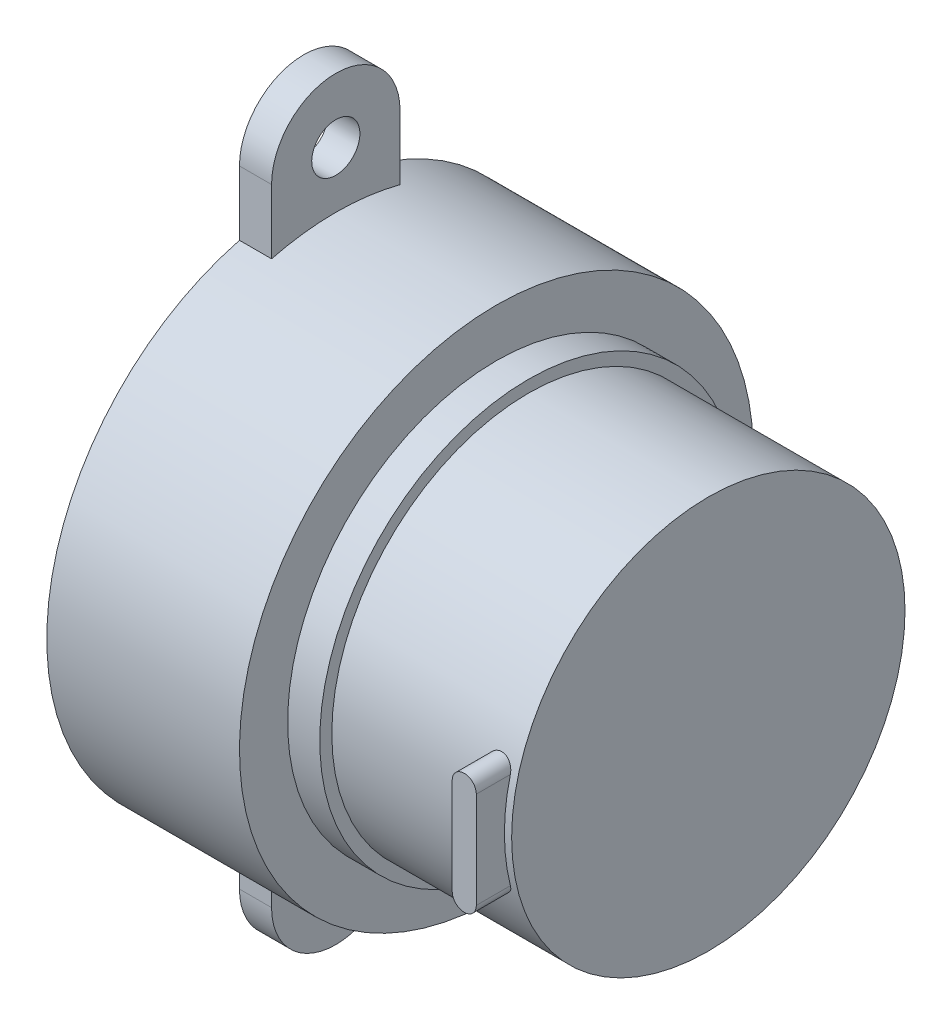
ISO-10303-21;
HEADER;
FILE_DESCRIPTION(('STEP AP214'),'2;1');
FILE_NAME('part.step','',(''),(''),'','','');
FILE_SCHEMA(('AUTOMOTIVE_DESIGN { 1 0 10303 214 1 1 1 1 }'));
ENDSEC;
DATA;
#1=APPLICATION_CONTEXT('core data for automotive mechanical design processes');
#2=APPLICATION_PROTOCOL_DEFINITION('international standard','automotive_design',2000,#1);
#3=PRODUCT_CONTEXT('',#1,'mechanical');
#4=PRODUCT('Part','Part','',(#3));
#5=PRODUCT_RELATED_PRODUCT_CATEGORY('part','',(#4));
#6=PRODUCT_DEFINITION_FORMATION('','',#4);
#7=PRODUCT_DEFINITION_CONTEXT('part definition',#1,'design');
#8=PRODUCT_DEFINITION('design','',#6,#7);
#9=PRODUCT_DEFINITION_SHAPE('','',#8);
#10=(LENGTH_UNIT() NAMED_UNIT(*) SI_UNIT(.MILLI.,.METRE.));
#11=(NAMED_UNIT(*) PLANE_ANGLE_UNIT() SI_UNIT($,.RADIAN.));
#12=(NAMED_UNIT(*) SI_UNIT($,.STERADIAN.) SOLID_ANGLE_UNIT());
#13=UNCERTAINTY_MEASURE_WITH_UNIT(LENGTH_MEASURE(1.E-05),#10,'distance_accuracy_value','');
#14=(GEOMETRIC_REPRESENTATION_CONTEXT(3) GLOBAL_UNCERTAINTY_ASSIGNED_CONTEXT((#13)) GLOBAL_UNIT_ASSIGNED_CONTEXT((#10,
#11,#12)) REPRESENTATION_CONTEXT('',''));
#15=CARTESIAN_POINT('',(0.,0.,0.));
#16=DIRECTION('',(0.,0.,1.));
#17=DIRECTION('',(1.,0.,0.));
#18=AXIS2_PLACEMENT_3D('',#15,#16,#17);
#19=CARTESIAN_POINT('',(25.2,0.,0.));
#20=DIRECTION('',(1.,0.,0.));
#21=DIRECTION('',(0.,1.,0.));
#22=AXIS2_PLACEMENT_3D('',#19,#20,#21);
#23=CYLINDRICAL_SURFACE('',#22,12.25);
#24=CARTESIAN_POINT('',(14.,0.,0.));
#25=DIRECTION('',(1.,0.,0.));
#26=DIRECTION('',(0.,1.,0.));
#27=AXIS2_PLACEMENT_3D('',#24,#25,#26);
#28=CIRCLE('',#27,12.25);
#29=CARTESIAN_POINT('',(14.,12.25,0.));
#30=VERTEX_POINT('',#29);
#31=EDGE_CURVE('E288',#30,#30,#28,.T.);
#32=ORIENTED_EDGE('',*,*,#31,.T.);
#33=EDGE_LOOP('',(#32));
#34=FACE_BOUND('',#33,.T.);
#35=CARTESIAN_POINT('',(25.2,0.,0.));
#36=DIRECTION('',(1.,0.,0.));
#37=DIRECTION('',(0.,1.,0.));
#38=AXIS2_PLACEMENT_3D('',#35,#36,#37);
#39=CIRCLE('',#38,12.25);
#40=CARTESIAN_POINT('',(25.2,12.25,0.));
#41=VERTEX_POINT('',#40);
#42=EDGE_CURVE('E279',#41,#41,#39,.T.);
#43=ORIENTED_EDGE('',*,*,#42,.F.);
#44=EDGE_LOOP('',(#43));
#45=FACE_BOUND('',#44,.T.);
#46=CARTESIAN_POINT('',(23.25,0.,0.));
#47=DIRECTION('',(1.,0.,0.));
#48=DIRECTION('',(0.,0.,-1.));
#49=AXIS2_PLACEMENT_3D('',#46,#47,#48);
#50=CIRCLE('',#49,12.25);
#51=CARTESIAN_POINT('',(23.25,-3.00414968149156,11.8759245825828));
#52=VERTEX_POINT('',#51);
#53=CARTESIAN_POINT('',(23.25,2.99585031850844,11.8780209155016));
#54=VERTEX_POINT('',#53);
#55=EDGE_CURVE('E53',#52,#54,#50,.F.);
#56=ORIENTED_EDGE('',*,*,#55,.T.);
#57=CARTESIAN_POINT('',(23.25,2.99585031850844,11.8780209155016));
#58=CARTESIAN_POINT('',(23.2500018151062,3.03936068676981,11.8670464450805));
#59=CARTESIAN_POINT('',(23.2537974298679,3.08284329070902,11.8558227008728));
#60=CARTESIAN_POINT('',(23.2688451062788,3.16850120592498,11.8332189007074));
#61=CARTESIAN_POINT('',(23.2801073854855,3.21067464280716,11.8218386515107));
#62=CARTESIAN_POINT('',(23.3097824751331,3.29248410159032,11.7993155613016));
#63=CARTESIAN_POINT('',(23.3281929388966,3.33212095125832,11.7881726436406));
#64=CARTESIAN_POINT('',(23.3716994229791,3.40772414334932,11.7665400079626));
#65=CARTESIAN_POINT('',(23.3967934655885,3.44369156722929,11.7560500978477));
#66=CARTESIAN_POINT('',(23.4528373335261,3.51063610469061,11.7362321809651));
#67=CARTESIAN_POINT('',(23.4837427801508,3.54164794185834,11.7268962036418));
#68=CARTESIAN_POINT('',(23.5507292867365,3.59798815097007,11.7097331714132));
#69=CARTESIAN_POINT('',(23.5868095552144,3.62331739054449,11.7019058861836));
#70=CARTESIAN_POINT('',(23.6617666674759,3.66659923504669,11.6884151056331));
#71=CARTESIAN_POINT('',(23.700498140881,3.68478243580946,11.6826844737521));
#72=CARTESIAN_POINT('',(23.7807120063835,3.7143474497353,11.6733185434752));
#73=CARTESIAN_POINT('',(23.822193541531,3.72573137066494,11.6696825957426));
#74=CARTESIAN_POINT('',(23.9047698133225,3.74091145805983,11.6648250050945));
#75=CARTESIAN_POINT('',(23.9458018023632,3.7450183510329,11.6635045203056));
#76=CARTESIAN_POINT('',(24.0279932259208,3.74645336840738,11.6630436916266));
#77=CARTESIAN_POINT('',(24.0691526391212,3.7437825712727,11.6639030008884));
#78=CARTESIAN_POINT('',(24.1494901567527,3.73189788396824,11.667710784042));
#79=CARTESIAN_POINT('',(24.1886918924031,3.72282787711424,11.6706133138722));
#80=CARTESIAN_POINT('',(24.2649764272577,3.69862275754783,11.6783067999213));
#81=CARTESIAN_POINT('',(24.3020591252911,3.68348735552691,11.683097846219));
#82=CARTESIAN_POINT('',(24.3736793109031,3.64738389093934,11.6944197036433));
#83=CARTESIAN_POINT('',(24.4081707554275,3.62633244906429,11.7009753240118));
#84=CARTESIAN_POINT('',(24.473150006227,3.57915305990342,11.7154927824416));
#85=CARTESIAN_POINT('',(24.5036370877851,3.55302419581202,11.723454874439));
#86=CARTESIAN_POINT('',(24.561053303903,3.49529222678644,11.740799574558));
#87=CARTESIAN_POINT('',(24.5877903283686,3.46351138808617,11.7502263959793));
#88=CARTESIAN_POINT('',(24.6355834649159,3.39615040145115,11.7698722460997));
#89=CARTESIAN_POINT('',(24.6566383691803,3.36056944798666,11.7800914426362));
#90=CARTESIAN_POINT('',(24.6933205391197,3.28505291906219,11.8013780947872));
#91=CARTESIAN_POINT('',(24.7086962186115,3.24499992062909,11.8124631333471));
#92=CARTESIAN_POINT('',(24.7324121251577,3.16288185681707,11.8347153690934));
#93=CARTESIAN_POINT('',(24.7407514479441,3.12081653356071,11.8458825766537));
#94=CARTESIAN_POINT('',(24.7502415166429,3.03501998587593,11.8681570908992));
#95=CARTESIAN_POINT('',(24.7512563678795,2.99127233837725,11.8792594641677));
#96=CARTESIAN_POINT('',(24.745648493211,2.9041171525149,11.9008663292481));
#97=CARTESIAN_POINT('',(24.7390259190927,2.86070960740928,11.9113708329378));
#98=CARTESIAN_POINT('',(24.7183295244998,2.77586395777271,11.9314276301441));
#99=CARTESIAN_POINT('',(24.7043159285996,2.73441284364693,11.94098688884));
#100=CARTESIAN_POINT('',(24.66918580401,2.65438399449385,11.9590312834866));
#101=CARTESIAN_POINT('',(24.6480701534638,2.61580590494741,11.9675165520539));
#102=CARTESIAN_POINT('',(24.5998539783655,2.54361688917972,11.9830650080282));
#103=CARTESIAN_POINT('',(24.5729052346726,2.50991077687006,11.9901568513219));
#104=CARTESIAN_POINT('',(24.5134797521601,2.44749412846226,12.0030533675291));
#105=CARTESIAN_POINT('',(24.4810037610676,2.41878291771393,12.0088582143036));
#106=CARTESIAN_POINT('',(24.4122930727206,2.36791903491718,12.0189898935667));
#107=CARTESIAN_POINT('',(24.3761675224157,2.34562526986073,12.0233489070713));
#108=CARTESIAN_POINT('',(24.3005664902398,2.3074077175077,12.0307418889033));
#109=CARTESIAN_POINT('',(24.2610913397067,2.29148330105205,12.0337759881074));
#110=CARTESIAN_POINT('',(24.1806147268659,2.26672641202528,12.0384637128144));
#111=CARTESIAN_POINT('',(24.1396491161946,2.25778144268983,12.0401392540498));
#112=CARTESIAN_POINT('',(24.0567690501018,2.246834830891,12.0421868842401));
#113=CARTESIAN_POINT('',(24.0148546440712,2.24483282783406,12.0425590408883));
#114=CARTESIAN_POINT('',(23.9316030990672,2.24782367253474,12.0420011082001));
#115=CARTESIAN_POINT('',(23.890263990536,2.25276387584892,12.0410808198217));
#116=CARTESIAN_POINT('',(23.8090165682158,2.26938995427252,12.0379582959601));
#117=CARTESIAN_POINT('',(23.7691082370515,2.28107574743349,12.0357560760504));
#118=CARTESIAN_POINT('',(23.6918233607202,2.31083731345606,12.0300772658401));
#119=CARTESIAN_POINT('',(23.6544482093571,2.32891657065208,12.0265999806114));
#120=CARTESIAN_POINT('',(23.5832864541981,2.37090498655441,12.0183927898931));
#121=CARTESIAN_POINT('',(23.5494997901268,2.39481404731599,12.0136629054479));
#122=CARTESIAN_POINT('',(23.486151169037,2.44796054830398,12.0029466436428));
#123=CARTESIAN_POINT('',(23.4566272370326,2.47724121762638,11.9969500077987));
#124=CARTESIAN_POINT('',(23.4029056613511,2.54012129001714,11.98379379772));
#125=CARTESIAN_POINT('',(23.3787096720832,2.57372202941914,11.9766338634591));
#126=CARTESIAN_POINT('',(23.3358691767155,2.64487253032391,11.9611244105882));
#127=CARTESIAN_POINT('',(23.3173294663477,2.68248121116879,11.9527562325449));
#128=CARTESIAN_POINT('',(23.2868217247977,2.76003265687349,11.9350867593904));
#129=CARTESIAN_POINT('',(23.2748469811797,2.7999729912818,11.925786428926));
#130=CARTESIAN_POINT('',(23.260846276982,2.8660930917916,11.9100254326405));
#131=CARTESIAN_POINT('',(23.2567796729262,2.89191168811879,11.9037834018114));
#132=CARTESIAN_POINT('',(23.2513559855524,2.94377360830509,11.8910642993429));
#133=CARTESIAN_POINT('',(23.2499989139747,2.96981693313747,11.8845872266851));
#134=CARTESIAN_POINT('',(23.25,2.99585031850844,11.8780209155016));
#135=B_SPLINE_CURVE_WITH_KNOTS('',3,(#57,#58,#59,#60,#61,#62,#63,#64,#65,#66,#67,#68,#69,#70,
#71,#72,#73,#74,#75,#76,#77,#78,#79,#80,#81,#82,#83,#84,#85,#86,#87,#88,#89,#90,#91,#92,#93,#94,
#95,#96,#97,#98,#99,#100,#101,#102,#103,#104,#105,#106,#107,#108,#109,#110,#111,#112,#113,#114,
#115,#116,#117,#118,#119,#120,#121,#122,#123,#124,#125,#126,#127,#128,#129,#130,#131,#132,#133,
#134),.UNSPECIFIED.,.T.,.F.,(4,2,2,2,2,2,2,2,2,2,2,2,2,2,2,2,2,2,2,2,2,2,2,2,2,2,2,2,2,2,2,2,2,
2,2,2,2,2,4),(0.,0.13452103371616,0.269226530154462,0.403887841467432,0.538509349907353,
0.672141756683597,0.805753746288996,0.934607017458299,1.06342032354665,1.18658726300796,
1.30973460541362,1.43019780511648,1.5506667513825,1.67292694418443,1.79520923346581,
1.92240345019745,2.04962468265173,2.1819489413421,2.31429020291976,2.44908069345878,
2.58386850520704,2.71757461222641,2.85126419304391,2.98182212645624,3.11236241198622,
3.23976404097916,3.36715308223308,3.49244379088075,3.61772799226657,3.74206724343222,
3.8664049841007,3.9908105915186,4.11521410898034,4.24066659946877,4.36615799014867,
4.49385008380098,4.62141137234762,4.7018984580015,4.78238589240331),.UNSPECIFIED.);
#136=CARTESIAN_POINT('',(24.75,2.99585031850844,11.8780209155016));
#137=VERTEX_POINT('',#136);
#138=EDGE_CURVE('E11',#54,#137,#135,.T.);
#139=ORIENTED_EDGE('',*,*,#138,.T.);
#140=CARTESIAN_POINT('',(24.75,0.,0.));
#141=DIRECTION('',(-1.,0.,0.));
#142=DIRECTION('',(0.,0.,1.));
#143=AXIS2_PLACEMENT_3D('',#140,#141,#142);
#144=CIRCLE('',#143,12.25);
#145=CARTESIAN_POINT('',(24.75,-3.00414968149156,11.8759245825828));
#146=VERTEX_POINT('',#145);
#147=EDGE_CURVE('E318',#137,#146,#144,.F.);
#148=ORIENTED_EDGE('',*,*,#147,.T.);
#149=CARTESIAN_POINT('',(23.25,-3.00414968149156,11.8759245825828));
#150=CARTESIAN_POINT('',(23.2500016635781,-2.96148787715478,11.8867160443931));
#151=CARTESIAN_POINT('',(23.2536501053191,-2.9187398649603,11.8972828561544));
#152=CARTESIAN_POINT('',(23.2682306942922,-2.83428781133223,11.917684550184));
#153=CARTESIAN_POINT('',(23.2791701538991,-2.7925848616347,11.927518686611));
#154=CARTESIAN_POINT('',(23.3081320217534,-2.71144784901863,11.9462247132142));
#155=CARTESIAN_POINT('',(23.3261585140241,-2.67201510939534,11.9550960447896));
#156=CARTESIAN_POINT('',(23.368860764207,-2.59667265546266,11.9716866314416));
#157=CARTESIAN_POINT('',(23.3935346000014,-2.56076192683147,11.9794062185508));
#158=CARTESIAN_POINT('',(23.4483514509702,-2.49424170339171,11.9934312985644));
#159=CARTESIAN_POINT('',(23.4783822296586,-2.46354480889974,11.9997607700213));
#160=CARTESIAN_POINT('',(23.5433857477014,-2.40762566518026,12.0111054828888));
#161=CARTESIAN_POINT('',(23.5783580623808,-2.38240294597467,12.0161208371288));
#162=CARTESIAN_POINT('',(23.6514005354377,-2.33875652756486,12.024691407562));
#163=CARTESIAN_POINT('',(23.6893837389373,-2.32019316726318,12.0282768184406));
#164=CARTESIAN_POINT('',(23.7680160846918,-2.28968385297837,12.0341219368942));
#165=CARTESIAN_POINT('',(23.8086649895811,-2.27773731069736,12.0363817623273));
#166=CARTESIAN_POINT('',(23.8908638507773,-2.26096434488717,12.0395437085068));
#167=CARTESIAN_POINT('',(23.9323933306705,-2.25604093264156,12.0404643271551));
#168=CARTESIAN_POINT('',(24.0157010447257,-2.25315676395871,12.0410044016449));
#169=CARTESIAN_POINT('',(24.0574792680961,-2.25519570762931,12.0406239135293));
#170=CARTESIAN_POINT('',(24.1398716741342,-2.26614277803829,12.0385683135035));
#171=CARTESIAN_POINT('',(24.1804907576134,-2.27501534218319,12.0368999039163));
#172=CARTESIAN_POINT('',(24.2596425909866,-2.29930960141506,12.032282701921));
#173=CARTESIAN_POINT('',(24.2981753488031,-2.31473127163061,12.0293339143754));
#174=CARTESIAN_POINT('',(24.3721876945127,-2.35169872223842,12.0221614883047));
#175=CARTESIAN_POINT('',(24.4076583711449,-2.37326164055611,12.0179342801144));
#176=CARTESIAN_POINT('',(24.4744588510514,-2.42183155432436,12.0082406392155));
#177=CARTESIAN_POINT('',(24.5057885061316,-2.44883874452103,12.0027741621766));
#178=CARTESIAN_POINT('',(24.5638066164777,-2.50781120944192,11.990592031317));
#179=CARTESIAN_POINT('',(24.590439861064,-2.53982805509919,11.9838632204135));
#180=CARTESIAN_POINT('',(24.6379637150739,-2.60764341903554,11.969289754166));
#181=CARTESIAN_POINT('',(24.6588538345599,-2.64344225959069,11.9614450037094));
#182=CARTESIAN_POINT('',(24.6947534698421,-2.71852289398785,11.9446071624568));
#183=CARTESIAN_POINT('',(24.709639940451,-2.75785912674153,11.9355946079383));
#184=CARTESIAN_POINT('',(24.7326217161905,-2.8382736267674,11.9167280924871));
#185=CARTESIAN_POINT('',(24.7407161412012,-2.87935211907899,11.9068740226922));
#186=CARTESIAN_POINT('',(24.7500946631899,-2.96316361873336,11.8862974960538));
#187=CARTESIAN_POINT('',(24.7512042383928,-3.00591235843417,11.8755595298709));
#188=CARTESIAN_POINT('',(24.7461824743912,-3.0908914256937,11.8537258284825));
#189=CARTESIAN_POINT('',(24.7400501292454,-3.13312168040873,11.8426300437824));
#190=CARTESIAN_POINT('',(24.7205354889058,-3.21677743929346,11.8201842845131));
#191=CARTESIAN_POINT('',(24.7070079352679,-3.25816898396129,11.8088337395842));
#192=CARTESIAN_POINT('',(24.6729613505398,-3.33808001143176,11.7864941706433));
#193=CARTESIAN_POINT('',(24.6524418553967,-3.376599303397,11.77550517068));
#194=CARTESIAN_POINT('',(24.6048920474707,-3.44969239352781,11.7543002189439));
#195=CARTESIAN_POINT('',(24.577854933896,-3.48426201451514,11.7440850893938));
#196=CARTESIAN_POINT('',(24.5179601791837,-3.54833673739574,11.724884951809));
#197=CARTESIAN_POINT('',(24.4851032931852,-3.57784249536897,11.7158997844497));
#198=CARTESIAN_POINT('',(24.4154198301968,-3.63006495384769,11.6998229384685));
#199=CARTESIAN_POINT('',(24.3787265638261,-3.65294540932429,11.6926861546958));
#200=CARTESIAN_POINT('',(24.3016911302062,-3.69215302703317,11.6803651857442));
#201=CARTESIAN_POINT('',(24.2613500803608,-3.70848218780776,11.6751804051158));
#202=CARTESIAN_POINT('',(24.1801017297448,-3.73338754582668,11.6672396734931));
#203=CARTESIAN_POINT('',(24.1393000007037,-3.74227715296669,11.6643856760039));
#204=CARTESIAN_POINT('',(24.0566968533742,-3.75316216094703,11.660887945079));
#205=CARTESIAN_POINT('',(24.0148956631051,-3.75515911946183,11.6602437122573));
#206=CARTESIAN_POINT('',(23.9329261142909,-3.75223304019868,11.6611855541609));
#207=CARTESIAN_POINT('',(23.8927487619243,-3.74753229498494,11.6626999848728));
#208=CARTESIAN_POINT('',(23.813793715335,-3.73178123596216,11.6677494130677));
#209=CARTESIAN_POINT('',(23.7750159998568,-3.72073101862181,11.6712843798522));
#210=CARTESIAN_POINT('',(23.6998238848809,-3.69263306328147,11.6802045016404));
#211=CARTESIAN_POINT('',(23.6634154066541,-3.67557093437803,11.685594095393));
#212=CARTESIAN_POINT('',(23.5939846574592,-3.6360109518374,11.6979635963494));
#213=CARTESIAN_POINT('',(23.5609627511651,-3.61351251367916,11.7049436745602));
#214=CARTESIAN_POINT('',(23.4980191464278,-3.56289932592668,11.7204509596638));
#215=CARTESIAN_POINT('',(23.4682414507789,-3.5346193073374,11.7290227846214));
#216=CARTESIAN_POINT('',(23.4138060447626,-3.4737711507745,11.7471877951454));
#217=CARTESIAN_POINT('',(23.3891506131107,-3.44120111480554,11.7567814324219));
#218=CARTESIAN_POINT('',(23.3445516404081,-3.37114625537408,11.7770649516883));
#219=CARTESIAN_POINT('',(23.3248615245671,-3.33350872460914,11.7877844348496));
#220=CARTESIAN_POINT('',(23.2921346107623,-3.25556625253472,11.8095478498617));
#221=CARTESIAN_POINT('',(23.2790916633439,-3.21526381574036,11.820591471802));
#222=CARTESIAN_POINT('',(23.263048063588,-3.14634504809886,11.8390813378634));
#223=CARTESIAN_POINT('',(23.2581649051338,-3.11815529866726,11.8465382323535));
#224=CARTESIAN_POINT('',(23.2516402819992,-3.06137320818296,11.8613386745536));
#225=CARTESIAN_POINT('',(23.2499988835399,-3.03278085891814,11.8686822199451));
#226=CARTESIAN_POINT('',(23.25,-3.00414968149156,11.8759245825828));
#227=B_SPLINE_CURVE_WITH_KNOTS('',3,(#149,#150,#151,#152,#153,#154,#155,#156,#157,#158,#159,
#160,#161,#162,#163,#164,#165,#166,#167,#168,#169,#170,#171,#172,#173,#174,#175,#176,#177,#178,
#179,#180,#181,#182,#183,#184,#185,#186,#187,#188,#189,#190,#191,#192,#193,#194,#195,#196,#197,
#198,#199,#200,#201,#202,#203,#204,#205,#206,#207,#208,#209,#210,#211,#212,#213,#214,#215,#216,
#217,#218,#219,#220,#221,#222,#223,#224,#225,#226),.UNSPECIFIED.,.T.,.F.,(4,2,2,2,2,2,2,2,2,2,2,
2,2,2,2,2,2,2,2,2,2,2,2,2,2,2,2,2,2,2,2,2,2,2,2,2,2,2,4),(0.,0.13191196075766,0.263956419354011,
0.396077082616875,0.528159583355122,0.65774458485274,0.787318456596968,0.913989443884578,
1.04064916711127,1.16554221326165,1.29042987991488,1.41467197850144,1.53891360526058,
1.66350539942552,1.78810165113286,1.91407702705733,2.04006314642463,2.1685140838396,
2.29698166348417,2.42864676763576,2.56033016292382,2.69469823457614,2.82907522593417,
2.96359304420708,3.09809342101684,3.22891143765159,3.35968951645575,3.48463262814135,
3.60954750199663,3.73041180415567,3.85127427004979,3.9724280360274,4.09359483446127,
4.21889087367097,4.34424253389837,4.47507993428194,4.60579607313039,4.69432298059727,
4.78285169643232),.UNSPECIFIED.);
#228=EDGE_CURVE('E321',#146,#52,#227,.T.);
#229=ORIENTED_EDGE('',*,*,#228,.T.);
#230=EDGE_LOOP('',(#56,#139,#148,#229));
#231=FACE_BOUND('',#230,.T.);
#232=ADVANCED_FACE('F40',(#34,#45,#231),#23,.T.);
#233=CARTESIAN_POINT('',(-10.2,0.,-8.));
#234=DIRECTION('',(-1.,0.,0.));
#235=DIRECTION('',(0.,-1.,0.));
#236=AXIS2_PLACEMENT_3D('',#233,#234,#235);
#237=CYLINDRICAL_SURFACE('',#236,2.5);
#238=CARTESIAN_POINT('',(-2.7,0.,-8.));
#239=DIRECTION('',(-1.,0.,0.));
#240=DIRECTION('',(0.,-1.,0.));
#241=AXIS2_PLACEMENT_3D('',#238,#239,#240);
#242=CIRCLE('',#241,2.5);
#243=CARTESIAN_POINT('',(-2.7,-2.5,-8.));
#244=VERTEX_POINT('',#243);
#245=EDGE_CURVE('E220',#244,#244,#242,.T.);
#246=ORIENTED_EDGE('',*,*,#245,.T.);
#247=EDGE_LOOP('',(#246));
#248=FACE_BOUND('',#247,.T.);
#249=DIRECTION('',(-1.,0.,0.));
#250=VECTOR('',#249,1.);
#251=CARTESIAN_POINT('',(-5.2,-1.5,-10.));
#252=LINE('',#251,#250);
#253=CARTESIAN_POINT('',(-5.2,-1.5,-10.));
#254=VERTEX_POINT('',#253);
#255=CARTESIAN_POINT('',(-10.2,-1.5,-10.));
#256=VERTEX_POINT('',#255);
#257=EDGE_CURVE('E68',#254,#256,#252,.T.);
#258=ORIENTED_EDGE('',*,*,#257,.F.);
#259=CARTESIAN_POINT('',(-5.2,0.,-8.));
#260=DIRECTION('',(-1.,0.,0.));
#261=DIRECTION('',(0.,0.,1.));
#262=AXIS2_PLACEMENT_3D('',#259,#260,#261);
#263=CIRCLE('',#262,2.5);
#264=CARTESIAN_POINT('',(-5.2,1.5,-10.));
#265=VERTEX_POINT('',#264);
#266=EDGE_CURVE('E192',#265,#254,#263,.T.);
#267=ORIENTED_EDGE('',*,*,#266,.F.);
#268=DIRECTION('',(-1.,0.,0.));
#269=VECTOR('',#268,1.);
#270=CARTESIAN_POINT('',(-5.2,1.5,-10.));
#271=LINE('',#270,#269);
#272=CARTESIAN_POINT('',(-10.2,1.5,-10.));
#273=VERTEX_POINT('',#272);
#274=EDGE_CURVE('E196',#265,#273,#271,.T.);
#275=ORIENTED_EDGE('',*,*,#274,.T.);
#276=CARTESIAN_POINT('',(-10.2,0.,-8.));
#277=DIRECTION('',(-1.,0.,0.));
#278=DIRECTION('',(0.,-1.,0.));
#279=AXIS2_PLACEMENT_3D('',#276,#277,#278);
#280=CIRCLE('',#279,2.5);
#281=CARTESIAN_POINT('',(-10.2,1.5,-6.));
#282=VERTEX_POINT('',#281);
#283=EDGE_CURVE('E219',#282,#273,#280,.T.);
#284=ORIENTED_EDGE('',*,*,#283,.F.);
#285=DIRECTION('',(-1.,0.,0.));
#286=VECTOR('',#285,1.);
#287=CARTESIAN_POINT('',(-5.2,1.5,-6.));
#288=LINE('',#287,#286);
#289=CARTESIAN_POINT('',(-5.2,1.5,-6.));
#290=VERTEX_POINT('',#289);
#291=EDGE_CURVE('E206',#290,#282,#288,.T.);
#292=ORIENTED_EDGE('',*,*,#291,.F.);
#293=CARTESIAN_POINT('',(-5.2,0.,-8.));
#294=DIRECTION('',(-1.,0.,0.));
#295=DIRECTION('',(0.,0.,1.));
#296=AXIS2_PLACEMENT_3D('',#293,#294,#295);
#297=CIRCLE('',#296,2.5);
#298=CARTESIAN_POINT('',(-5.2,-1.5,-6.));
#299=VERTEX_POINT('',#298);
#300=EDGE_CURVE('E185',#299,#290,#297,.T.);
#301=ORIENTED_EDGE('',*,*,#300,.F.);
#302=DIRECTION('',(-1.,0.,0.));
#303=VECTOR('',#302,1.);
#304=CARTESIAN_POINT('',(-5.2,-1.5,-6.));
#305=LINE('',#304,#303);
#306=CARTESIAN_POINT('',(-10.2,-1.5,-6.));
#307=VERTEX_POINT('',#306);
#308=EDGE_CURVE('E198',#299,#307,#305,.T.);
#309=ORIENTED_EDGE('',*,*,#308,.T.);
#310=EDGE_CURVE('E216',#256,#307,#280,.T.);
#311=ORIENTED_EDGE('',*,*,#310,.F.);
#312=EDGE_LOOP('',(#258,#267,#275,#284,#292,#301,#309,#311));
#313=FACE_BOUND('',#312,.T.);
#314=ADVANCED_FACE('F369',(#248,#313),#237,.T.);
#315=CARTESIAN_POINT('',(-10.2,2.5,-8.));
#316=DIRECTION('',(1.,0.,0.));
#317=DIRECTION('',(0.,1.,0.));
#318=AXIS2_PLACEMENT_3D('',#315,#316,#317);
#319=PLANE('',#318);
#320=CARTESIAN_POINT('',(-10.2,0.,-8.));
#321=DIRECTION('',(-1.,0.,0.));
#322=DIRECTION('',(0.,0.,1.));
#323=AXIS2_PLACEMENT_3D('',#320,#321,#322);
#324=CIRCLE('',#323,1.25);
#325=CARTESIAN_POINT('',(-10.2,0.,-6.75));
#326=VERTEX_POINT('',#325);
#327=EDGE_CURVE('E200',#326,#326,#324,.T.);
#328=ORIENTED_EDGE('',*,*,#327,.F.);
#329=EDGE_LOOP('',(#328));
#330=FACE_BOUND('',#329,.T.);
#331=DIRECTION('',(0.,-1.,0.));
#332=VECTOR('',#331,1.);
#333=CARTESIAN_POINT('',(-10.2,0.,-10.));
#334=LINE('',#333,#332);
#335=EDGE_CURVE('E193',#273,#256,#334,.T.);
#336=ORIENTED_EDGE('',*,*,#335,.T.);
#337=ORIENTED_EDGE('',*,*,#310,.T.);
#338=DIRECTION('',(0.,-1.,0.));
#339=VECTOR('',#338,1.);
#340=CARTESIAN_POINT('',(-10.2,0.,-6.));
#341=LINE('',#340,#339);
#342=EDGE_CURVE('E183',#282,#307,#341,.T.);
#343=ORIENTED_EDGE('',*,*,#342,.F.);
#344=ORIENTED_EDGE('',*,*,#283,.T.);
#345=EDGE_LOOP('',(#336,#337,#343,#344));
#346=FACE_BOUND('',#345,.T.);
#347=ADVANCED_FACE('F366',(#330,#346),#319,.F.);
#348=CARTESIAN_POINT('',(0.,0.,0.));
#349=DIRECTION('',(-1.,0.,0.));
#350=DIRECTION('',(0.,-1.,0.));
#351=AXIS2_PLACEMENT_3D('',#348,#349,#350);
#352=PLANE('',#351);
#353=CARTESIAN_POINT('',(0.,0.,-8.));
#354=DIRECTION('',(-1.,0.,0.));
#355=DIRECTION('',(0.,-1.,0.));
#356=AXIS2_PLACEMENT_3D('',#353,#354,#355);
#357=CIRCLE('',#356,4.25);
#358=CARTESIAN_POINT('',(0.,-4.25,-8.));
#359=VERTEX_POINT('',#358);
#360=EDGE_CURVE('E232',#359,#359,#357,.T.);
#361=ORIENTED_EDGE('',*,*,#360,.F.);
#362=EDGE_LOOP('',(#361));
#363=FACE_BOUND('',#362,.T.);
#364=CARTESIAN_POINT('',(0.,0.,0.));
#365=DIRECTION('',(1.,0.,0.));
#366=DIRECTION('',(0.,1.,0.));
#367=AXIS2_PLACEMENT_3D('',#364,#365,#366);
#368=CIRCLE('',#367,16.);
#369=CARTESIAN_POINT('',(0.,-15.4919333848297,-4.));
#370=VERTEX_POINT('',#369);
#371=CARTESIAN_POINT('',(0.,15.4919333848297,-4.00000000000001));
#372=VERTEX_POINT('',#371);
#373=EDGE_CURVE('E300',#370,#372,#368,.T.);
#374=ORIENTED_EDGE('',*,*,#373,.F.);
#375=DIRECTION('',(0.,-1.,0.));
#376=VECTOR('',#375,1.);
#377=CARTESIAN_POINT('',(0.,19.5,-4.00000000000001));
#378=LINE('',#377,#376);
#379=CARTESIAN_POINT('',(0.,-19.5,-4.));
#380=VERTEX_POINT('',#379);
#381=EDGE_CURVE('E266',#370,#380,#378,.T.);
#382=ORIENTED_EDGE('',*,*,#381,.T.);
#383=CARTESIAN_POINT('',(0.,-19.5,0.));
#384=DIRECTION('',(-1.,0.,0.));
#385=DIRECTION('',(0.,-1.,0.));
#386=AXIS2_PLACEMENT_3D('',#383,#384,#385);
#387=CIRCLE('',#386,4.);
#388=CARTESIAN_POINT('',(0.,-19.5,4.));
#389=VERTEX_POINT('',#388);
#390=EDGE_CURVE('E270',#380,#389,#387,.T.);
#391=ORIENTED_EDGE('',*,*,#390,.T.);
#392=DIRECTION('',(0.,1.,0.));
#393=VECTOR('',#392,1.);
#394=CARTESIAN_POINT('',(0.,19.5,3.99999999999999));
#395=LINE('',#394,#393);
#396=CARTESIAN_POINT('',(0.,-15.4919333848297,4.));
#397=VERTEX_POINT('',#396);
#398=EDGE_CURVE('E252',#389,#397,#395,.T.);
#399=ORIENTED_EDGE('',*,*,#398,.T.);
#400=CARTESIAN_POINT('',(0.,15.4919333848297,3.99999999999999));
#401=VERTEX_POINT('',#400);
#402=EDGE_CURVE('E301',#401,#397,#368,.T.);
#403=ORIENTED_EDGE('',*,*,#402,.F.);
#404=CARTESIAN_POINT('',(0.,19.5,3.99999999999999));
#405=VERTEX_POINT('',#404);
#406=EDGE_CURVE('E273',#401,#405,#395,.T.);
#407=ORIENTED_EDGE('',*,*,#406,.T.);
#408=CARTESIAN_POINT('',(0.,19.5,0.));
#409=DIRECTION('',(-1.,0.,0.));
#410=DIRECTION('',(0.,-1.,0.));
#411=AXIS2_PLACEMENT_3D('',#408,#409,#410);
#412=CIRCLE('',#411,4.);
#413=CARTESIAN_POINT('',(0.,19.5,-4.00000000000001));
#414=VERTEX_POINT('',#413);
#415=EDGE_CURVE('E245',#405,#414,#412,.T.);
#416=ORIENTED_EDGE('',*,*,#415,.T.);
#417=EDGE_CURVE('E267',#414,#372,#378,.T.);
#418=ORIENTED_EDGE('',*,*,#417,.T.);
#419=EDGE_LOOP('',(#374,#382,#391,#399,#403,#407,#416,#418));
#420=FACE_BOUND('',#419,.T.);
#421=CARTESIAN_POINT('',(0.,-19.5,0.));
#422=DIRECTION('',(-1.,0.,0.));
#423=DIRECTION('',(0.,-1.,0.));
#424=AXIS2_PLACEMENT_3D('',#421,#422,#423);
#425=CIRCLE('',#424,1.5);
#426=CARTESIAN_POINT('',(0.,-21.,0.));
#427=VERTEX_POINT('',#426);
#428=EDGE_CURVE('E235',#427,#427,#425,.T.);
#429=ORIENTED_EDGE('',*,*,#428,.F.);
#430=EDGE_LOOP('',(#429));
#431=FACE_BOUND('',#430,.T.);
#432=CARTESIAN_POINT('',(0.,19.5,0.));
#433=DIRECTION('',(-1.,0.,0.));
#434=DIRECTION('',(0.,-1.,0.));
#435=AXIS2_PLACEMENT_3D('',#432,#433,#434);
#436=CIRCLE('',#435,1.5);
#437=CARTESIAN_POINT('',(0.,18.,0.));
#438=VERTEX_POINT('',#437);
#439=EDGE_CURVE('E239',#438,#438,#436,.T.);
#440=ORIENTED_EDGE('',*,*,#439,.F.);
#441=EDGE_LOOP('',(#440));
#442=FACE_BOUND('',#441,.T.);
#443=ADVANCED_FACE('F42',(#363,#420,#431,#442),#352,.T.);
#444=CARTESIAN_POINT('',(25.2,0.,0.));
#445=DIRECTION('',(1.,0.,0.));
#446=DIRECTION('',(0.,1.,0.));
#447=AXIS2_PLACEMENT_3D('',#444,#445,#446);
#448=CYLINDRICAL_SURFACE('',#447,16.);
#449=DIRECTION('',(1.,0.,0.));
#450=VECTOR('',#449,1.);
#451=CARTESIAN_POINT('',(25.2,15.4919333848297,3.99999999999999));
#452=LINE('',#451,#450);
#453=CARTESIAN_POINT('',(2.,15.4919333848297,3.99999999999999));
#454=VERTEX_POINT('',#453);
#455=EDGE_CURVE('E315',#401,#454,#452,.T.);
#456=ORIENTED_EDGE('',*,*,#455,.F.);
#457=ORIENTED_EDGE('',*,*,#402,.T.);
#458=DIRECTION('',(1.,0.,0.));
#459=VECTOR('',#458,1.);
#460=CARTESIAN_POINT('',(25.2,-15.4919333848297,4.));
#461=LINE('',#460,#459);
#462=CARTESIAN_POINT('',(2.,-15.4919333848297,4.));
#463=VERTEX_POINT('',#462);
#464=EDGE_CURVE('E309',#463,#397,#461,.F.);
#465=ORIENTED_EDGE('',*,*,#464,.F.);
#466=CARTESIAN_POINT('',(2.,0.,0.));
#467=DIRECTION('',(-1.,0.,0.));
#468=DIRECTION('',(0.,-1.,0.));
#469=AXIS2_PLACEMENT_3D('',#466,#467,#468);
#470=CIRCLE('',#469,16.);
#471=CARTESIAN_POINT('',(2.,-15.4919333848297,-4.));
#472=VERTEX_POINT('',#471);
#473=EDGE_CURVE('E303',#463,#472,#470,.F.);
#474=ORIENTED_EDGE('',*,*,#473,.T.);
#475=DIRECTION('',(1.,0.,0.));
#476=VECTOR('',#475,1.);
#477=CARTESIAN_POINT('',(25.2,-15.4919333848297,-4.));
#478=LINE('',#477,#476);
#479=EDGE_CURVE('E305',#370,#472,#478,.T.);
#480=ORIENTED_EDGE('',*,*,#479,.F.);
#481=ORIENTED_EDGE('',*,*,#373,.T.);
#482=DIRECTION('',(1.,0.,0.));
#483=VECTOR('',#482,1.);
#484=CARTESIAN_POINT('',(25.2,15.4919333848297,-4.00000000000001));
#485=LINE('',#484,#483);
#486=CARTESIAN_POINT('',(2.,15.4919333848297,-4.00000000000001));
#487=VERTEX_POINT('',#486);
#488=EDGE_CURVE('E312',#487,#372,#485,.F.);
#489=ORIENTED_EDGE('',*,*,#488,.F.);
#490=EDGE_CURVE('E306',#487,#454,#470,.F.);
#491=ORIENTED_EDGE('',*,*,#490,.T.);
#492=EDGE_LOOP('',(#456,#457,#465,#474,#480,#481,#489,#491));
#493=FACE_BOUND('',#492,.T.);
#494=CARTESIAN_POINT('',(12.,0.,0.));
#495=DIRECTION('',(1.,0.,0.));
#496=DIRECTION('',(0.,1.,0.));
#497=AXIS2_PLACEMENT_3D('',#494,#495,#496);
#498=CIRCLE('',#497,16.);
#499=CARTESIAN_POINT('',(12.,16.,0.));
#500=VERTEX_POINT('',#499);
#501=EDGE_CURVE('E297',#500,#500,#498,.T.);
#502=ORIENTED_EDGE('',*,*,#501,.F.);
#503=EDGE_LOOP('',(#502));
#504=FACE_BOUND('',#503,.T.);
#505=ADVANCED_FACE('F570',(#493,#504),#448,.T.);
#506=CARTESIAN_POINT('',(12.,16.,0.));
#507=DIRECTION('',(1.,0.,0.));
#508=DIRECTION('',(0.,1.,0.));
#509=AXIS2_PLACEMENT_3D('',#506,#507,#508);
#510=PLANE('',#509);
#511=ORIENTED_EDGE('',*,*,#501,.T.);
#512=EDGE_LOOP('',(#511));
#513=FACE_BOUND('',#512,.T.);
#514=CARTESIAN_POINT('',(12.,0.,0.));
#515=DIRECTION('',(1.,0.,0.));
#516=DIRECTION('',(0.,1.,0.));
#517=AXIS2_PLACEMENT_3D('',#514,#515,#516);
#518=CIRCLE('',#517,13.);
#519=CARTESIAN_POINT('',(12.,13.,0.));
#520=VERTEX_POINT('',#519);
#521=EDGE_CURVE('E294',#520,#520,#518,.T.);
#522=ORIENTED_EDGE('',*,*,#521,.F.);
#523=EDGE_LOOP('',(#522));
#524=FACE_BOUND('',#523,.T.);
#525=ADVANCED_FACE('F655',(#513,#524),#510,.T.);
#526=CARTESIAN_POINT('',(25.2,0.,0.));
#527=DIRECTION('',(1.,0.,0.));
#528=DIRECTION('',(0.,1.,0.));
#529=AXIS2_PLACEMENT_3D('',#526,#527,#528);
#530=CYLINDRICAL_SURFACE('',#529,13.);
#531=ORIENTED_EDGE('',*,*,#521,.T.);
#532=EDGE_LOOP('',(#531));
#533=FACE_BOUND('',#532,.T.);
#534=CARTESIAN_POINT('',(14.,0.,0.));
#535=DIRECTION('',(1.,0.,0.));
#536=DIRECTION('',(0.,1.,0.));
#537=AXIS2_PLACEMENT_3D('',#534,#535,#536);
#538=CIRCLE('',#537,13.);
#539=CARTESIAN_POINT('',(14.,13.,0.));
#540=VERTEX_POINT('',#539);
#541=EDGE_CURVE('E291',#540,#540,#538,.T.);
#542=ORIENTED_EDGE('',*,*,#541,.F.);
#543=EDGE_LOOP('',(#542));
#544=FACE_BOUND('',#543,.T.);
#545=ADVANCED_FACE('F426',(#533,#544),#530,.T.);
#546=CARTESIAN_POINT('',(14.,13.,0.));
#547=DIRECTION('',(1.,0.,0.));
#548=DIRECTION('',(0.,1.,0.));
#549=AXIS2_PLACEMENT_3D('',#546,#547,#548);
#550=PLANE('',#549);
#551=ORIENTED_EDGE('',*,*,#541,.T.);
#552=EDGE_LOOP('',(#551));
#553=FACE_BOUND('',#552,.T.);
#554=ORIENTED_EDGE('',*,*,#31,.F.);
#555=EDGE_LOOP('',(#554));
#556=FACE_BOUND('',#555,.T.);
#557=ADVANCED_FACE('F421',(#553,#556),#550,.T.);
#558=CARTESIAN_POINT('',(25.2,12.25,0.));
#559=DIRECTION('',(1.,0.,0.));
#560=DIRECTION('',(0.,1.,0.));
#561=AXIS2_PLACEMENT_3D('',#558,#559,#560);
#562=PLANE('',#561);
#563=ORIENTED_EDGE('',*,*,#42,.T.);
#564=EDGE_LOOP('',(#563));
#565=FACE_BOUND('',#564,.T.);
#566=ADVANCED_FACE('F412',(#565),#562,.T.);
#567=CARTESIAN_POINT('',(2.,-19.5,0.));
#568=DIRECTION('',(-1.,0.,0.));
#569=DIRECTION('',(0.,-1.,0.));
#570=AXIS2_PLACEMENT_3D('',#567,#568,#569);
#571=CYLINDRICAL_SURFACE('',#570,4.);
#572=ORIENTED_EDGE('',*,*,#390,.F.);
#573=DIRECTION('',(-1.,0.,0.));
#574=VECTOR('',#573,1.);
#575=CARTESIAN_POINT('',(2.,-19.5,-4.));
#576=LINE('',#575,#574);
#577=CARTESIAN_POINT('',(2.,-19.5,-4.));
#578=VERTEX_POINT('',#577);
#579=EDGE_CURVE('E282',#578,#380,#576,.T.);
#580=ORIENTED_EDGE('',*,*,#579,.F.);
#581=CARTESIAN_POINT('',(2.,-19.5,0.));
#582=DIRECTION('',(-1.,0.,0.));
#583=DIRECTION('',(0.,-1.,0.));
#584=AXIS2_PLACEMENT_3D('',#581,#582,#583);
#585=CIRCLE('',#584,4.);
#586=CARTESIAN_POINT('',(2.,-19.5,4.));
#587=VERTEX_POINT('',#586);
#588=EDGE_CURVE('E256',#578,#587,#585,.T.);
#589=ORIENTED_EDGE('',*,*,#588,.T.);
#590=DIRECTION('',(-1.,0.,0.));
#591=VECTOR('',#590,1.);
#592=CARTESIAN_POINT('',(2.,-19.5,4.));
#593=LINE('',#592,#591);
#594=EDGE_CURVE('E280',#587,#389,#593,.T.);
#595=ORIENTED_EDGE('',*,*,#594,.T.);
#596=EDGE_LOOP('',(#572,#580,#589,#595));
#597=FACE_BOUND('',#596,.T.);
#598=ADVANCED_FACE('F394',(#597),#571,.T.);
#599=CARTESIAN_POINT('',(2.,-19.5,0.));
#600=DIRECTION('',(-1.,0.,0.));
#601=DIRECTION('',(0.,-1.,0.));
#602=AXIS2_PLACEMENT_3D('',#599,#600,#601);
#603=CYLINDRICAL_SURFACE('',#602,1.5);
#604=CARTESIAN_POINT('',(2.,-19.5,0.));
#605=DIRECTION('',(-1.,0.,0.));
#606=DIRECTION('',(0.,-1.,0.));
#607=AXIS2_PLACEMENT_3D('',#604,#605,#606);
#608=CIRCLE('',#607,1.5);
#609=CARTESIAN_POINT('',(2.,-21.,0.));
#610=VERTEX_POINT('',#609);
#611=EDGE_CURVE('E236',#610,#610,#608,.T.);
#612=ORIENTED_EDGE('',*,*,#611,.F.);
#613=EDGE_LOOP('',(#612));
#614=FACE_BOUND('',#613,.T.);
#615=ORIENTED_EDGE('',*,*,#428,.T.);
#616=EDGE_LOOP('',(#615));
#617=FACE_BOUND('',#616,.T.);
#618=ADVANCED_FACE('F390',(#614,#617),#603,.F.);
#619=CARTESIAN_POINT('',(2.,19.5,0.));
#620=DIRECTION('',(-1.,0.,0.));
#621=DIRECTION('',(0.,-1.,0.));
#622=AXIS2_PLACEMENT_3D('',#619,#620,#621);
#623=PLANE('',#622);
#624=ORIENTED_EDGE('',*,*,#473,.F.);
#625=DIRECTION('',(0.,1.,0.));
#626=VECTOR('',#625,1.);
#627=CARTESIAN_POINT('',(2.,19.5,3.99999999999999));
#628=LINE('',#627,#626);
#629=EDGE_CURVE('E260',#587,#463,#628,.T.);
#630=ORIENTED_EDGE('',*,*,#629,.F.);
#631=ORIENTED_EDGE('',*,*,#588,.F.);
#632=DIRECTION('',(0.,-1.,0.));
#633=VECTOR('',#632,1.);
#634=CARTESIAN_POINT('',(2.,19.5,-4.00000000000001));
#635=LINE('',#634,#633);
#636=EDGE_CURVE('E251',#472,#578,#635,.T.);
#637=ORIENTED_EDGE('',*,*,#636,.F.);
#638=EDGE_LOOP('',(#624,#630,#631,#637));
#639=FACE_BOUND('',#638,.T.);
#640=ORIENTED_EDGE('',*,*,#611,.T.);
#641=EDGE_LOOP('',(#640));
#642=FACE_BOUND('',#641,.T.);
#643=ADVANCED_FACE('F393',(#639,#642),#623,.F.);
#644=CARTESIAN_POINT('',(2.,19.5,-4.00000000000001));
#645=DIRECTION('',(0.,0.,-1.));
#646=DIRECTION('',(0.,1.,0.));
#647=AXIS2_PLACEMENT_3D('',#644,#645,#646);
#648=PLANE('',#647);
#649=ORIENTED_EDGE('',*,*,#381,.F.);
#650=ORIENTED_EDGE('',*,*,#479,.T.);
#651=ORIENTED_EDGE('',*,*,#636,.T.);
#652=ORIENTED_EDGE('',*,*,#579,.T.);
#653=EDGE_LOOP('',(#649,#650,#651,#652));
#654=FACE_BOUND('',#653,.T.);
#655=ADVANCED_FACE('F402',(#654),#648,.T.);
#656=CARTESIAN_POINT('',(2.,19.5,3.99999999999999));
#657=DIRECTION('',(0.,0.,1.));
#658=DIRECTION('',(0.,-1.,0.));
#659=AXIS2_PLACEMENT_3D('',#656,#657,#658);
#660=PLANE('',#659);
#661=ORIENTED_EDGE('',*,*,#629,.T.);
#662=ORIENTED_EDGE('',*,*,#464,.T.);
#663=ORIENTED_EDGE('',*,*,#398,.F.);
#664=ORIENTED_EDGE('',*,*,#594,.F.);
#665=EDGE_LOOP('',(#661,#662,#663,#664));
#666=FACE_BOUND('',#665,.T.);
#667=ADVANCED_FACE('F409',(#666),#660,.T.);
#668=CARTESIAN_POINT('',(2.,19.5,-4.00000000000001));
#669=VERTEX_POINT('',#668);
#670=EDGE_CURVE('E253',#669,#487,#635,.T.);
#671=ORIENTED_EDGE('',*,*,#670,.T.);
#672=ORIENTED_EDGE('',*,*,#488,.T.);
#673=ORIENTED_EDGE('',*,*,#417,.F.);
#674=DIRECTION('',(-1.,0.,0.));
#675=VECTOR('',#674,1.);
#676=CARTESIAN_POINT('',(2.,19.5,-4.00000000000001));
#677=LINE('',#676,#675);
#678=EDGE_CURVE('E263',#669,#414,#677,.T.);
#679=ORIENTED_EDGE('',*,*,#678,.F.);
#680=EDGE_LOOP('',(#671,#672,#673,#679));
#681=FACE_BOUND('',#680,.T.);
#682=ADVANCED_FACE('F417',(#681),#648,.T.);
#683=ORIENTED_EDGE('',*,*,#490,.F.);
#684=ORIENTED_EDGE('',*,*,#670,.F.);
#685=CARTESIAN_POINT('',(2.,19.5,0.));
#686=DIRECTION('',(-1.,0.,0.));
#687=DIRECTION('',(0.,-1.,0.));
#688=AXIS2_PLACEMENT_3D('',#685,#686,#687);
#689=CIRCLE('',#688,4.);
#690=CARTESIAN_POINT('',(2.,19.5,3.99999999999999));
#691=VERTEX_POINT('',#690);
#692=EDGE_CURVE('E248',#691,#669,#689,.T.);
#693=ORIENTED_EDGE('',*,*,#692,.F.);
#694=EDGE_CURVE('E259',#454,#691,#628,.T.);
#695=ORIENTED_EDGE('',*,*,#694,.F.);
#696=EDGE_LOOP('',(#683,#684,#693,#695));
#697=FACE_BOUND('',#696,.T.);
#698=CARTESIAN_POINT('',(2.,19.5,0.));
#699=DIRECTION('',(-1.,0.,0.));
#700=DIRECTION('',(0.,-1.,0.));
#701=AXIS2_PLACEMENT_3D('',#698,#699,#700);
#702=CIRCLE('',#701,1.5);
#703=CARTESIAN_POINT('',(2.,18.,0.));
#704=VERTEX_POINT('',#703);
#705=EDGE_CURVE('E242',#704,#704,#702,.T.);
#706=ORIENTED_EDGE('',*,*,#705,.T.);
#707=EDGE_LOOP('',(#706));
#708=FACE_BOUND('',#707,.T.);
#709=ADVANCED_FACE('F404',(#697,#708),#623,.F.);
#710=CARTESIAN_POINT('',(2.,19.5,0.));
#711=DIRECTION('',(-1.,0.,0.));
#712=DIRECTION('',(0.,-1.,0.));
#713=AXIS2_PLACEMENT_3D('',#710,#711,#712);
#714=CYLINDRICAL_SURFACE('',#713,4.);
#715=ORIENTED_EDGE('',*,*,#415,.F.);
#716=DIRECTION('',(-1.,0.,0.));
#717=VECTOR('',#716,1.);
#718=CARTESIAN_POINT('',(2.,19.5,3.99999999999999));
#719=LINE('',#718,#717);
#720=EDGE_CURVE('E276',#691,#405,#719,.T.);
#721=ORIENTED_EDGE('',*,*,#720,.F.);
#722=ORIENTED_EDGE('',*,*,#692,.T.);
#723=ORIENTED_EDGE('',*,*,#678,.T.);
#724=EDGE_LOOP('',(#715,#721,#722,#723));
#725=FACE_BOUND('',#724,.T.);
#726=ADVANCED_FACE('F407',(#725),#714,.T.);
#727=ORIENTED_EDGE('',*,*,#406,.F.);
#728=ORIENTED_EDGE('',*,*,#455,.T.);
#729=ORIENTED_EDGE('',*,*,#694,.T.);
#730=ORIENTED_EDGE('',*,*,#720,.T.);
#731=EDGE_LOOP('',(#727,#728,#729,#730));
#732=FACE_BOUND('',#731,.T.);
#733=ADVANCED_FACE('F398',(#732),#660,.T.);
#734=CARTESIAN_POINT('',(2.,19.5,0.));
#735=DIRECTION('',(-1.,0.,0.));
#736=DIRECTION('',(0.,-1.,0.));
#737=AXIS2_PLACEMENT_3D('',#734,#735,#736);
#738=CYLINDRICAL_SURFACE('',#737,1.5);
#739=ORIENTED_EDGE('',*,*,#705,.F.);
#740=EDGE_LOOP('',(#739));
#741=FACE_BOUND('',#740,.T.);
#742=ORIENTED_EDGE('',*,*,#439,.T.);
#743=EDGE_LOOP('',(#742));
#744=FACE_BOUND('',#743,.T.);
#745=ADVANCED_FACE('F388',(#741,#744),#738,.F.);
#746=CARTESIAN_POINT('',(-10.2,0.,-8.));
#747=DIRECTION('',(-1.,0.,0.));
#748=DIRECTION('',(0.,-1.,0.));
#749=AXIS2_PLACEMENT_3D('',#746,#747,#748);
#750=CYLINDRICAL_SURFACE('',#749,4.25);
#751=CARTESIAN_POINT('',(-0.500000000000002,0.,-8.));
#752=DIRECTION('',(-1.,0.,0.));
#753=DIRECTION('',(0.,-1.,0.));
#754=AXIS2_PLACEMENT_3D('',#751,#752,#753);
#755=CIRCLE('',#754,4.25);
#756=CARTESIAN_POINT('',(-0.500000000000002,-4.25,-8.));
#757=VERTEX_POINT('',#756);
#758=EDGE_CURVE('E229',#757,#757,#755,.T.);
#759=ORIENTED_EDGE('',*,*,#758,.F.);
#760=EDGE_LOOP('',(#759));
#761=FACE_BOUND('',#760,.T.);
#762=ORIENTED_EDGE('',*,*,#360,.T.);
#763=EDGE_LOOP('',(#762));
#764=FACE_BOUND('',#763,.T.);
#765=ADVANCED_FACE('F384',(#761,#764),#750,.T.);
#766=CARTESIAN_POINT('',(-0.500000000000003,4.25,-8.));
#767=DIRECTION('',(1.,0.,0.));
#768=DIRECTION('',(0.,1.,0.));
#769=AXIS2_PLACEMENT_3D('',#766,#767,#768);
#770=PLANE('',#769);
#771=CARTESIAN_POINT('',(-0.500000000000002,0.,-8.));
#772=DIRECTION('',(-1.,0.,0.));
#773=DIRECTION('',(0.,-1.,0.));
#774=AXIS2_PLACEMENT_3D('',#771,#772,#773);
#775=CIRCLE('',#774,4.);
#776=CARTESIAN_POINT('',(-0.500000000000002,-4.,-8.));
#777=VERTEX_POINT('',#776);
#778=EDGE_CURVE('E226',#777,#777,#775,.T.);
#779=ORIENTED_EDGE('',*,*,#778,.F.);
#780=EDGE_LOOP('',(#779));
#781=FACE_BOUND('',#780,.T.);
#782=ORIENTED_EDGE('',*,*,#758,.T.);
#783=EDGE_LOOP('',(#782));
#784=FACE_BOUND('',#783,.T.);
#785=ADVANCED_FACE('F380',(#781,#784),#770,.F.);
#786=CARTESIAN_POINT('',(-10.2,0.,-8.));
#787=DIRECTION('',(-1.,0.,0.));
#788=DIRECTION('',(0.,-1.,0.));
#789=AXIS2_PLACEMENT_3D('',#786,#787,#788);
#790=CYLINDRICAL_SURFACE('',#789,4.);
#791=CARTESIAN_POINT('',(-2.7,0.,-8.));
#792=DIRECTION('',(-1.,0.,0.));
#793=DIRECTION('',(0.,-1.,0.));
#794=AXIS2_PLACEMENT_3D('',#791,#792,#793);
#795=CIRCLE('',#794,4.);
#796=CARTESIAN_POINT('',(-2.7,-4.,-8.));
#797=VERTEX_POINT('',#796);
#798=EDGE_CURVE('E223',#797,#797,#795,.T.);
#799=ORIENTED_EDGE('',*,*,#798,.F.);
#800=EDGE_LOOP('',(#799));
#801=FACE_BOUND('',#800,.T.);
#802=ORIENTED_EDGE('',*,*,#778,.T.);
#803=EDGE_LOOP('',(#802));
#804=FACE_BOUND('',#803,.T.);
#805=ADVANCED_FACE('F376',(#801,#804),#790,.T.);
#806=CARTESIAN_POINT('',(-2.7,4.,-8.));
#807=DIRECTION('',(1.,0.,0.));
#808=DIRECTION('',(0.,1.,0.));
#809=AXIS2_PLACEMENT_3D('',#806,#807,#808);
#810=PLANE('',#809);
#811=ORIENTED_EDGE('',*,*,#245,.F.);
#812=EDGE_LOOP('',(#811));
#813=FACE_BOUND('',#812,.T.);
#814=ORIENTED_EDGE('',*,*,#798,.T.);
#815=EDGE_LOOP('',(#814));
#816=FACE_BOUND('',#815,.T.);
#817=ADVANCED_FACE('F364',(#813,#816),#810,.F.);
#818=CARTESIAN_POINT('',(-4.2,0.,-8.));
#819=DIRECTION('',(-1.,0.,0.));
#820=DIRECTION('',(0.,0.,1.));
#821=AXIS2_PLACEMENT_3D('',#818,#819,#820);
#822=CONICAL_SURFACE('',#821,1.25,1.02974425867665);
#823=CARTESIAN_POINT('',(-3.44892422621555,0.,-8.));
#824=VERTEX_POINT('',#823);
#825=VERTEX_LOOP('',#824);
#826=FACE_BOUND('',#825,.T.);
#827=CARTESIAN_POINT('',(-4.2,0.,-8.));
#828=DIRECTION('',(-1.,0.,0.));
#829=DIRECTION('',(0.,0.,1.));
#830=AXIS2_PLACEMENT_3D('',#827,#828,#829);
#831=CIRCLE('',#830,1.25);
#832=CARTESIAN_POINT('',(-4.2,0.,-6.75));
#833=VERTEX_POINT('',#832);
#834=EDGE_CURVE('E213',#833,#833,#831,.T.);
#835=ORIENTED_EDGE('',*,*,#834,.T.);
#836=EDGE_LOOP('',(#835));
#837=FACE_BOUND('',#836,.T.);
#838=ADVANCED_FACE('F360',(#826,#837),#822,.F.);
#839=CARTESIAN_POINT('',(-10.2,0.,-8.));
#840=DIRECTION('',(-1.,0.,0.));
#841=DIRECTION('',(0.,0.,1.));
#842=AXIS2_PLACEMENT_3D('',#839,#840,#841);
#843=CYLINDRICAL_SURFACE('',#842,1.25);
#844=ORIENTED_EDGE('',*,*,#834,.F.);
#845=EDGE_LOOP('',(#844));
#846=FACE_BOUND('',#845,.T.);
#847=ORIENTED_EDGE('',*,*,#327,.T.);
#848=EDGE_LOOP('',(#847));
#849=FACE_BOUND('',#848,.T.);
#850=ADVANCED_FACE('F356',(#846,#849),#843,.F.);
#851=CARTESIAN_POINT('',(-5.2,0.,-6.));
#852=DIRECTION('',(0.,0.,-1.));
#853=DIRECTION('',(-1.,0.,0.));
#854=AXIS2_PLACEMENT_3D('',#851,#852,#853);
#855=PLANE('',#854);
#856=ORIENTED_EDGE('',*,*,#342,.T.);
#857=ORIENTED_EDGE('',*,*,#308,.F.);
#858=DIRECTION('',(0.,-1.,0.));
#859=VECTOR('',#858,1.);
#860=CARTESIAN_POINT('',(-5.2,0.,-6.));
#861=LINE('',#860,#859);
#862=EDGE_CURVE('E204',#290,#299,#861,.T.);
#863=ORIENTED_EDGE('',*,*,#862,.F.);
#864=ORIENTED_EDGE('',*,*,#291,.T.);
#865=EDGE_LOOP('',(#856,#857,#863,#864));
#866=FACE_BOUND('',#865,.T.);
#867=ADVANCED_FACE('F352',(#866),#855,.F.);
#868=CARTESIAN_POINT('',(-5.2,0.,0.));
#869=DIRECTION('',(-1.,0.,0.));
#870=DIRECTION('',(0.,0.,1.));
#871=AXIS2_PLACEMENT_3D('',#868,#869,#870);
#872=PLANE('',#871);
#873=ORIENTED_EDGE('',*,*,#300,.T.);
#874=ORIENTED_EDGE('',*,*,#862,.T.);
#875=EDGE_LOOP('',(#873,#874));
#876=FACE_BOUND('',#875,.T.);
#877=ADVANCED_FACE('F349',(#876),#872,.T.);
#878=CARTESIAN_POINT('',(-5.2,0.,-10.));
#879=DIRECTION('',(0.,0.,-1.));
#880=DIRECTION('',(-1.,0.,0.));
#881=AXIS2_PLACEMENT_3D('',#878,#879,#880);
#882=PLANE('',#881);
#883=ORIENTED_EDGE('',*,*,#335,.F.);
#884=ORIENTED_EDGE('',*,*,#274,.F.);
#885=DIRECTION('',(0.,-1.,0.));
#886=VECTOR('',#885,1.);
#887=CARTESIAN_POINT('',(-5.2,0.,-10.));
#888=LINE('',#887,#886);
#889=EDGE_CURVE('E190',#265,#254,#888,.T.);
#890=ORIENTED_EDGE('',*,*,#889,.T.);
#891=ORIENTED_EDGE('',*,*,#257,.T.);
#892=EDGE_LOOP('',(#883,#884,#890,#891));
#893=FACE_BOUND('',#892,.T.);
#894=ADVANCED_FACE('F345',(#893),#882,.T.);
#895=CARTESIAN_POINT('',(-5.2,0.,0.));
#896=DIRECTION('',(-1.,0.,0.));
#897=DIRECTION('',(0.,0.,1.));
#898=AXIS2_PLACEMENT_3D('',#895,#896,#897);
#899=PLANE('',#898);
#900=ORIENTED_EDGE('',*,*,#889,.F.);
#901=ORIENTED_EDGE('',*,*,#266,.T.);
#902=EDGE_LOOP('',(#900,#901));
#903=FACE_BOUND('',#902,.T.);
#904=ADVANCED_FACE('F342',(#903),#899,.T.);
#905=CARTESIAN_POINT('',(24.,2.99585031850844,14.));
#906=DIRECTION('',(0.,0.,-1.));
#907=DIRECTION('',(-1.,0.,0.));
#908=AXIS2_PLACEMENT_3D('',#905,#906,#907);
#909=CYLINDRICAL_SURFACE('',#908,0.750000000000001);
#910=ORIENTED_EDGE('',*,*,#138,.F.);
#911=DIRECTION('',(0.,0.,-1.));
#912=VECTOR('',#911,1.);
#913=CARTESIAN_POINT('',(23.25,2.99585031850844,14.));
#914=LINE('',#913,#912);
#915=CARTESIAN_POINT('',(23.25,2.99585031850844,14.));
#916=VERTEX_POINT('',#915);
#917=EDGE_CURVE('E166',#916,#54,#914,.T.);
#918=ORIENTED_EDGE('',*,*,#917,.F.);
#919=CARTESIAN_POINT('',(24.,2.99585031850844,14.));
#920=DIRECTION('',(0.,0.,1.));
#921=DIRECTION('',(1.,0.,0.));
#922=AXIS2_PLACEMENT_3D('',#919,#920,#921);
#923=CIRCLE('',#922,0.750000000000001);
#924=CARTESIAN_POINT('',(24.75,2.99585031850844,14.));
#925=VERTEX_POINT('',#924);
#926=EDGE_CURVE('E173',#925,#916,#923,.T.);
#927=ORIENTED_EDGE('',*,*,#926,.F.);
#928=DIRECTION('',(0.,0.,-1.));
#929=VECTOR('',#928,1.);
#930=CARTESIAN_POINT('',(24.75,2.99585031850844,14.));
#931=LINE('',#930,#929);
#932=EDGE_CURVE('E437',#925,#137,#931,.T.);
#933=ORIENTED_EDGE('',*,*,#932,.T.);
#934=EDGE_LOOP('',(#910,#918,#927,#933));
#935=FACE_BOUND('',#934,.T.);
#936=ADVANCED_FACE('F182',(#935),#909,.T.);
#937=CARTESIAN_POINT('',(23.25,2.99585031850844,14.));
#938=DIRECTION('',(1.,0.,0.));
#939=DIRECTION('',(0.,0.,-1.));
#940=AXIS2_PLACEMENT_3D('',#937,#938,#939);
#941=PLANE('',#940);
#942=ORIENTED_EDGE('',*,*,#55,.F.);
#943=DIRECTION('',(0.,0.,-1.));
#944=VECTOR('',#943,1.);
#945=CARTESIAN_POINT('',(23.25,-3.00414968149156,14.));
#946=LINE('',#945,#944);
#947=CARTESIAN_POINT('',(23.25,-3.00414968149156,14.));
#948=VERTEX_POINT('',#947);
#949=EDGE_CURVE('E169',#948,#52,#946,.T.);
#950=ORIENTED_EDGE('',*,*,#949,.F.);
#951=DIRECTION('',(0.,-1.,0.));
#952=VECTOR('',#951,1.);
#953=CARTESIAN_POINT('',(23.25,2.99585031850844,14.));
#954=LINE('',#953,#952);
#955=EDGE_CURVE('E162',#916,#948,#954,.T.);
#956=ORIENTED_EDGE('',*,*,#955,.F.);
#957=ORIENTED_EDGE('',*,*,#917,.T.);
#958=EDGE_LOOP('',(#942,#950,#956,#957));
#959=FACE_BOUND('',#958,.T.);
#960=ADVANCED_FACE('F164',(#959),#941,.F.);
#961=CARTESIAN_POINT('',(24.,-3.00414968149156,14.));
#962=DIRECTION('',(0.,0.,-1.));
#963=DIRECTION('',(-1.,0.,0.));
#964=AXIS2_PLACEMENT_3D('',#961,#962,#963);
#965=CYLINDRICAL_SURFACE('',#964,0.750000000000001);
#966=ORIENTED_EDGE('',*,*,#228,.F.);
#967=DIRECTION('',(0.,0.,-1.));
#968=VECTOR('',#967,1.);
#969=CARTESIAN_POINT('',(24.75,-3.00414968149156,14.));
#970=LINE('',#969,#968);
#971=CARTESIAN_POINT('',(24.75,-3.00414968149156,14.));
#972=VERTEX_POINT('',#971);
#973=EDGE_CURVE('E60',#972,#146,#970,.T.);
#974=ORIENTED_EDGE('',*,*,#973,.F.);
#975=CARTESIAN_POINT('',(24.,-3.00414968149156,14.));
#976=DIRECTION('',(0.,0.,1.));
#977=DIRECTION('',(1.,0.,0.));
#978=AXIS2_PLACEMENT_3D('',#975,#976,#977);
#979=CIRCLE('',#978,0.750000000000001);
#980=EDGE_CURVE('E172',#948,#972,#979,.T.);
#981=ORIENTED_EDGE('',*,*,#980,.F.);
#982=ORIENTED_EDGE('',*,*,#949,.T.);
#983=EDGE_LOOP('',(#966,#974,#981,#982));
#984=FACE_BOUND('',#983,.T.);
#985=ADVANCED_FACE('F330',(#984),#965,.T.);
#986=CARTESIAN_POINT('',(24.75,2.99585031850844,14.));
#987=DIRECTION('',(-1.,0.,0.));
#988=DIRECTION('',(0.,0.,1.));
#989=AXIS2_PLACEMENT_3D('',#986,#987,#988);
#990=PLANE('',#989);
#991=ORIENTED_EDGE('',*,*,#147,.F.);
#992=ORIENTED_EDGE('',*,*,#932,.F.);
#993=DIRECTION('',(0.,1.,0.));
#994=VECTOR('',#993,1.);
#995=CARTESIAN_POINT('',(24.75,2.99585031850844,14.));
#996=LINE('',#995,#994);
#997=EDGE_CURVE('E177',#972,#925,#996,.T.);
#998=ORIENTED_EDGE('',*,*,#997,.F.);
#999=ORIENTED_EDGE('',*,*,#973,.T.);
#1000=EDGE_LOOP('',(#991,#992,#998,#999));
#1001=FACE_BOUND('',#1000,.T.);
#1002=ADVANCED_FACE('F335',(#1001),#990,.F.);
#1003=CARTESIAN_POINT('',(24.,2.99585031850844,14.));
#1004=DIRECTION('',(0.,0.,1.));
#1005=DIRECTION('',(1.,0.,0.));
#1006=AXIS2_PLACEMENT_3D('',#1003,#1004,#1005);
#1007=PLANE('',#1006);
#1008=ORIENTED_EDGE('',*,*,#926,.T.);
#1009=ORIENTED_EDGE('',*,*,#955,.T.);
#1010=ORIENTED_EDGE('',*,*,#980,.T.);
#1011=ORIENTED_EDGE('',*,*,#997,.T.);
#1012=EDGE_LOOP('',(#1008,#1009,#1010,#1011));
#1013=FACE_BOUND('',#1012,.T.);
#1014=ADVANCED_FACE('F176',(#1013),#1007,.T.);
#1015=CLOSED_SHELL('',(#232,#314,#347,#443,#505,#525,#545,#557,#566,#598,#618,#643,#655,#667,
#682,#709,#726,#733,#745,#765,#785,#805,#817,#838,#850,#867,#877,#894,#904,#936,#960,#985,#1002,#1014));
#1016=MANIFOLD_SOLID_BREP('B2',#1015);
#1017=ADVANCED_BREP_SHAPE_REPRESENTATION('',(#18,#1016),#14);
#1018=SHAPE_DEFINITION_REPRESENTATION(#9,#1017);
ENDSEC;
END-ISO-10303-21;
